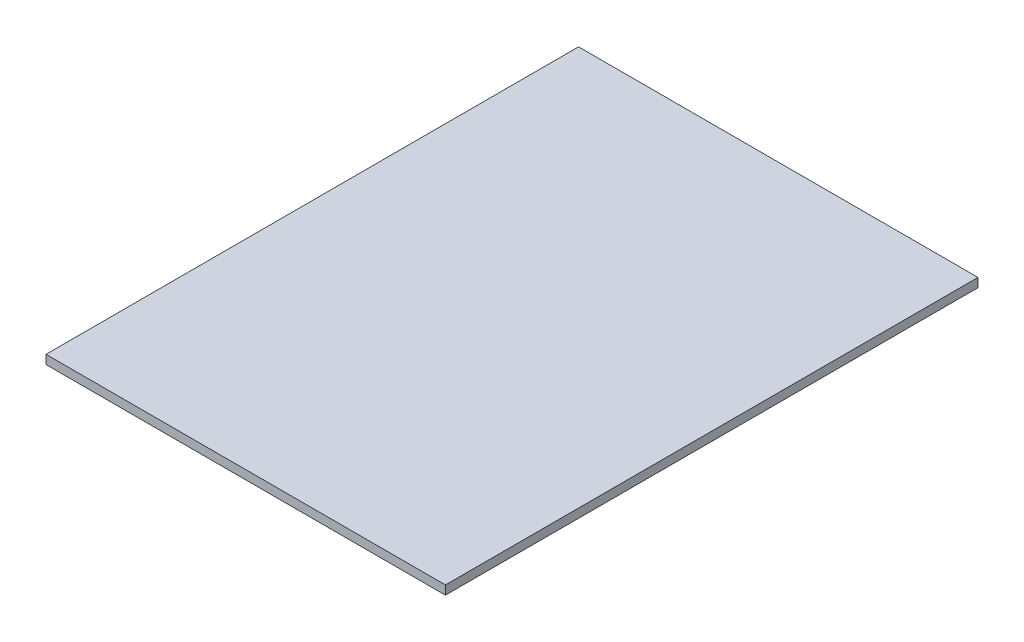
ISO-10303-21;
HEADER;
FILE_DESCRIPTION(('STEP AP214'),'2;1');
FILE_NAME('part.step','',(''),(''),'','','');
FILE_SCHEMA(('AUTOMOTIVE_DESIGN { 1 0 10303 214 1 1 1 1 }'));
ENDSEC;
DATA;
#1=APPLICATION_CONTEXT('core data for automotive mechanical design processes');
#2=APPLICATION_PROTOCOL_DEFINITION('international standard','automotive_design',2000,#1);
#3=PRODUCT_CONTEXT('',#1,'mechanical');
#4=PRODUCT('Part','Part','',(#3));
#5=PRODUCT_RELATED_PRODUCT_CATEGORY('part','',(#4));
#6=PRODUCT_DEFINITION_FORMATION('','',#4);
#7=PRODUCT_DEFINITION_CONTEXT('part definition',#1,'design');
#8=PRODUCT_DEFINITION('design','',#6,#7);
#9=PRODUCT_DEFINITION_SHAPE('','',#8);
#10=(LENGTH_UNIT() NAMED_UNIT(*) SI_UNIT(.MILLI.,.METRE.));
#11=(NAMED_UNIT(*) PLANE_ANGLE_UNIT() SI_UNIT($,.RADIAN.));
#12=(NAMED_UNIT(*) SI_UNIT($,.STERADIAN.) SOLID_ANGLE_UNIT());
#13=UNCERTAINTY_MEASURE_WITH_UNIT(LENGTH_MEASURE(1.E-05),#10,'distance_accuracy_value','');
#14=(GEOMETRIC_REPRESENTATION_CONTEXT(3) GLOBAL_UNCERTAINTY_ASSIGNED_CONTEXT((#13)) GLOBAL_UNIT_ASSIGNED_CONTEXT((#10,
#11,#12)) REPRESENTATION_CONTEXT('',''));
#15=CARTESIAN_POINT('',(0.,0.,0.));
#16=DIRECTION('',(0.,0.,1.));
#17=DIRECTION('',(1.,0.,0.));
#18=AXIS2_PLACEMENT_3D('',#15,#16,#17);
#19=CARTESIAN_POINT('',(-270.,6.,0.));
#20=DIRECTION('',(0.,0.,-1.));
#21=DIRECTION('',(-1.,0.,0.));
#22=AXIS2_PLACEMENT_3D('',#19,#20,#21);
#23=PLANE('',#22);
#24=DIRECTION('',(1.,0.,0.));
#25=VECTOR('',#24,1.);
#26=CARTESIAN_POINT('',(-270.,0.,0.));
#27=LINE('',#26,#25);
#28=CARTESIAN_POINT('',(-270.,0.,0.));
#29=VERTEX_POINT('',#28);
#30=CARTESIAN_POINT('',(0.,0.,0.));
#31=VERTEX_POINT('',#30);
#32=EDGE_CURVE('E96',#29,#31,#27,.T.);
#33=ORIENTED_EDGE('',*,*,#32,.T.);
#34=DIRECTION('',(0.,-1.,0.));
#35=VECTOR('',#34,1.);
#36=CARTESIAN_POINT('',(0.,6.,0.));
#37=LINE('',#36,#35);
#38=CARTESIAN_POINT('',(0.,6.,0.));
#39=VERTEX_POINT('',#38);
#40=EDGE_CURVE('E11',#39,#31,#37,.T.);
#41=ORIENTED_EDGE('',*,*,#40,.F.);
#42=DIRECTION('',(1.,0.,0.));
#43=VECTOR('',#42,1.);
#44=CARTESIAN_POINT('',(-270.,6.,0.));
#45=LINE('',#44,#43);
#46=CARTESIAN_POINT('',(-270.,6.,0.));
#47=VERTEX_POINT('',#46);
#48=EDGE_CURVE('E84',#47,#39,#45,.T.);
#49=ORIENTED_EDGE('',*,*,#48,.F.);
#50=DIRECTION('',(0.,-1.,0.));
#51=VECTOR('',#50,1.);
#52=CARTESIAN_POINT('',(-270.,6.,0.));
#53=LINE('',#52,#51);
#54=EDGE_CURVE('E92',#47,#29,#53,.T.);
#55=ORIENTED_EDGE('',*,*,#54,.T.);
#56=EDGE_LOOP('',(#33,#41,#49,#55));
#57=FACE_BOUND('',#56,.T.);
#58=ADVANCED_FACE('F33',(#57),#23,.F.);
#59=CARTESIAN_POINT('',(0.,6.,0.));
#60=DIRECTION('',(-1.,0.,0.));
#61=DIRECTION('',(0.,0.,1.));
#62=AXIS2_PLACEMENT_3D('',#59,#60,#61);
#63=PLANE('',#62);
#64=DIRECTION('',(0.,0.,-1.));
#65=VECTOR('',#64,1.);
#66=CARTESIAN_POINT('',(0.,0.,0.));
#67=LINE('',#66,#65);
#68=CARTESIAN_POINT('',(0.,0.,-360.));
#69=VERTEX_POINT('',#68);
#70=EDGE_CURVE('E88',#31,#69,#67,.T.);
#71=ORIENTED_EDGE('',*,*,#70,.T.);
#72=DIRECTION('',(0.,-1.,0.));
#73=VECTOR('',#72,1.);
#74=CARTESIAN_POINT('',(0.,6.,-360.));
#75=LINE('',#74,#73);
#76=CARTESIAN_POINT('',(0.,6.,-360.));
#77=VERTEX_POINT('',#76);
#78=EDGE_CURVE('E41',#77,#69,#75,.T.);
#79=ORIENTED_EDGE('',*,*,#78,.F.);
#80=DIRECTION('',(0.,0.,-1.));
#81=VECTOR('',#80,1.);
#82=CARTESIAN_POINT('',(0.,6.,0.));
#83=LINE('',#82,#81);
#84=EDGE_CURVE('E79',#39,#77,#83,.T.);
#85=ORIENTED_EDGE('',*,*,#84,.F.);
#86=ORIENTED_EDGE('',*,*,#40,.T.);
#87=EDGE_LOOP('',(#71,#79,#85,#86));
#88=FACE_BOUND('',#87,.T.);
#89=ADVANCED_FACE('F87',(#88),#63,.F.);
#90=CARTESIAN_POINT('',(0.,6.,-360.));
#91=DIRECTION('',(0.,0.,1.));
#92=DIRECTION('',(1.,0.,0.));
#93=AXIS2_PLACEMENT_3D('',#90,#91,#92);
#94=PLANE('',#93);
#95=DIRECTION('',(-1.,0.,0.));
#96=VECTOR('',#95,1.);
#97=CARTESIAN_POINT('',(0.,0.,-360.));
#98=LINE('',#97,#96);
#99=CARTESIAN_POINT('',(-270.,0.,-360.));
#100=VERTEX_POINT('',#99);
#101=EDGE_CURVE('E66',#69,#100,#98,.T.);
#102=ORIENTED_EDGE('',*,*,#101,.T.);
#103=DIRECTION('',(0.,-1.,0.));
#104=VECTOR('',#103,1.);
#105=CARTESIAN_POINT('',(-270.,6.,-360.));
#106=LINE('',#105,#104);
#107=CARTESIAN_POINT('',(-270.,6.,-360.));
#108=VERTEX_POINT('',#107);
#109=EDGE_CURVE('E89',#108,#100,#106,.T.);
#110=ORIENTED_EDGE('',*,*,#109,.F.);
#111=DIRECTION('',(-1.,0.,0.));
#112=VECTOR('',#111,1.);
#113=CARTESIAN_POINT('',(0.,6.,-360.));
#114=LINE('',#113,#112);
#115=EDGE_CURVE('E82',#77,#108,#114,.T.);
#116=ORIENTED_EDGE('',*,*,#115,.F.);
#117=ORIENTED_EDGE('',*,*,#78,.T.);
#118=EDGE_LOOP('',(#102,#110,#116,#117));
#119=FACE_BOUND('',#118,.T.);
#120=ADVANCED_FACE('F90',(#119),#94,.F.);
#121=CARTESIAN_POINT('',(-270.,6.,-360.));
#122=DIRECTION('',(1.,0.,0.));
#123=DIRECTION('',(0.,0.,-1.));
#124=AXIS2_PLACEMENT_3D('',#121,#122,#123);
#125=PLANE('',#124);
#126=DIRECTION('',(0.,0.,1.));
#127=VECTOR('',#126,1.);
#128=CARTESIAN_POINT('',(-270.,0.,-360.));
#129=LINE('',#128,#127);
#130=EDGE_CURVE('E72',#100,#29,#129,.T.);
#131=ORIENTED_EDGE('',*,*,#130,.T.);
#132=ORIENTED_EDGE('',*,*,#54,.F.);
#133=DIRECTION('',(0.,0.,1.));
#134=VECTOR('',#133,1.);
#135=CARTESIAN_POINT('',(-270.,6.,-360.));
#136=LINE('',#135,#134);
#137=EDGE_CURVE('E49',#108,#47,#136,.T.);
#138=ORIENTED_EDGE('',*,*,#137,.F.);
#139=ORIENTED_EDGE('',*,*,#109,.T.);
#140=EDGE_LOOP('',(#131,#132,#138,#139));
#141=FACE_BOUND('',#140,.T.);
#142=ADVANCED_FACE('F103',(#141),#125,.F.);
#143=CARTESIAN_POINT('',(0.,6.,0.));
#144=DIRECTION('',(0.,1.,0.));
#145=DIRECTION('',(0.,0.,1.));
#146=AXIS2_PLACEMENT_3D('',#143,#144,#145);
#147=PLANE('',#146);
#148=ORIENTED_EDGE('',*,*,#48,.T.);
#149=ORIENTED_EDGE('',*,*,#84,.T.);
#150=ORIENTED_EDGE('',*,*,#115,.T.);
#151=ORIENTED_EDGE('',*,*,#137,.T.);
#152=EDGE_LOOP('',(#148,#149,#150,#151));
#153=FACE_BOUND('',#152,.T.);
#154=ADVANCED_FACE('F80',(#153),#147,.T.);
#155=CARTESIAN_POINT('',(0.,0.,0.));
#156=DIRECTION('',(0.,1.,0.));
#157=DIRECTION('',(0.,0.,1.));
#158=AXIS2_PLACEMENT_3D('',#155,#156,#157);
#159=PLANE('',#158);
#160=ORIENTED_EDGE('',*,*,#32,.F.);
#161=ORIENTED_EDGE('',*,*,#130,.F.);
#162=ORIENTED_EDGE('',*,*,#101,.F.);
#163=ORIENTED_EDGE('',*,*,#70,.F.);
#164=EDGE_LOOP('',(#160,#161,#162,#163));
#165=FACE_BOUND('',#164,.T.);
#166=ADVANCED_FACE('F106',(#165),#159,.F.);
#167=CLOSED_SHELL('',(#58,#89,#120,#142,#154,#166));
#168=MANIFOLD_SOLID_BREP('B2',#167);
#169=ADVANCED_BREP_SHAPE_REPRESENTATION('',(#18,#168),#14);
#170=SHAPE_DEFINITION_REPRESENTATION(#9,#169);
ENDSEC;
END-ISO-10303-21;
